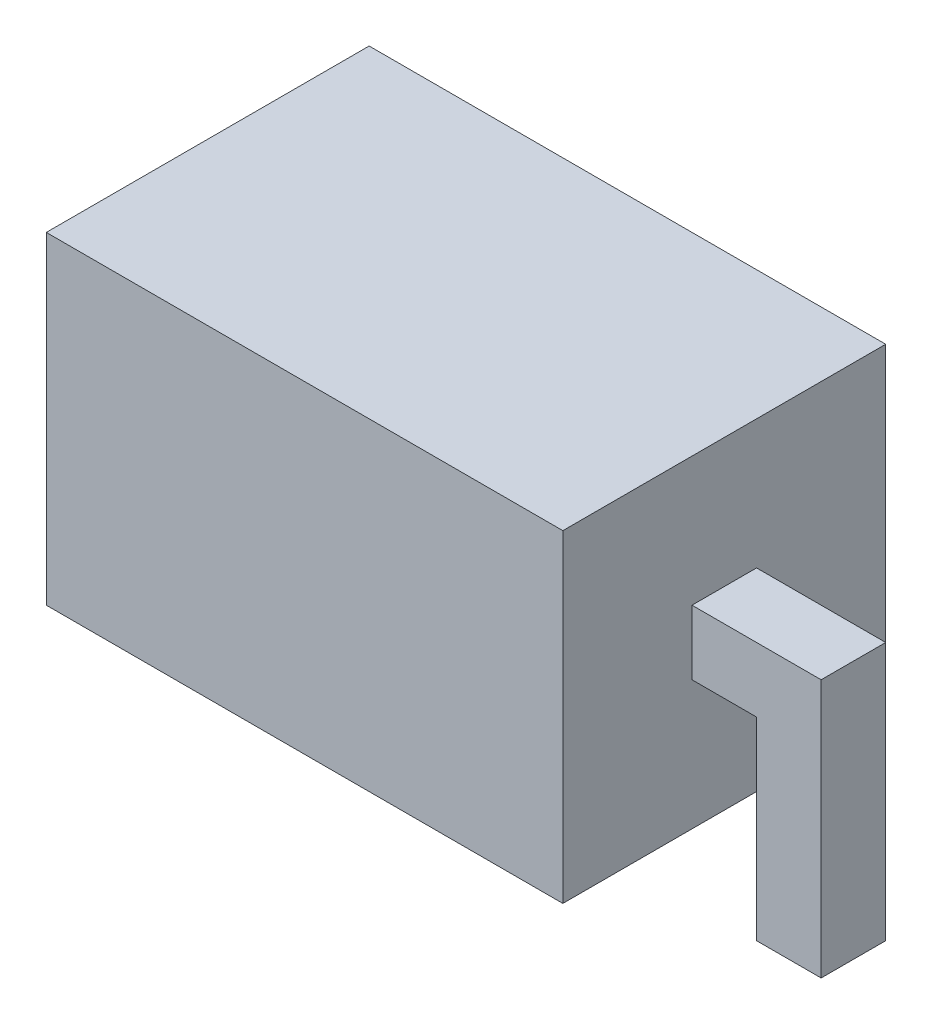
ISO-10303-21;
HEADER;
FILE_DESCRIPTION(('STEP AP214'),'2;1');
FILE_NAME('part.step','',(''),(''),'','','');
FILE_SCHEMA(('AUTOMOTIVE_DESIGN { 1 0 10303 214 1 1 1 1 }'));
ENDSEC;
DATA;
#1=APPLICATION_CONTEXT('core data for automotive mechanical design processes');
#2=APPLICATION_PROTOCOL_DEFINITION('international standard','automotive_design',2000,#1);
#3=PRODUCT_CONTEXT('',#1,'mechanical');
#4=PRODUCT('Part','Part','',(#3));
#5=PRODUCT_RELATED_PRODUCT_CATEGORY('part','',(#4));
#6=PRODUCT_DEFINITION_FORMATION('','',#4);
#7=PRODUCT_DEFINITION_CONTEXT('part definition',#1,'design');
#8=PRODUCT_DEFINITION('design','',#6,#7);
#9=PRODUCT_DEFINITION_SHAPE('','',#8);
#10=(LENGTH_UNIT() NAMED_UNIT(*) SI_UNIT(.MILLI.,.METRE.));
#11=(NAMED_UNIT(*) PLANE_ANGLE_UNIT() SI_UNIT($,.RADIAN.));
#12=(NAMED_UNIT(*) SI_UNIT($,.STERADIAN.) SOLID_ANGLE_UNIT());
#13=UNCERTAINTY_MEASURE_WITH_UNIT(LENGTH_MEASURE(1.E-05),#10,'distance_accuracy_value','');
#14=(GEOMETRIC_REPRESENTATION_CONTEXT(3) GLOBAL_UNCERTAINTY_ASSIGNED_CONTEXT((#13)) GLOBAL_UNIT_ASSIGNED_CONTEXT((#10,
#11,#12)) REPRESENTATION_CONTEXT('',''));
#15=CARTESIAN_POINT('',(0.,0.,0.));
#16=DIRECTION('',(0.,0.,1.));
#17=DIRECTION('',(1.,0.,0.));
#18=AXIS2_PLACEMENT_3D('',#15,#16,#17);
#19=CARTESIAN_POINT('',(2.,-1.25,2.5));
#20=DIRECTION('',(-1.,0.,0.));
#21=DIRECTION('',(0.,0.,1.));
#22=AXIS2_PLACEMENT_3D('',#19,#20,#21);
#23=PLANE('',#22);
#24=DIRECTION('',(0.,1.,0.));
#25=VECTOR('',#24,1.);
#26=CARTESIAN_POINT('',(2.,0.,1.));
#27=LINE('',#26,#25);
#28=CARTESIAN_POINT('',(1.99999999999999,-0.25,1.));
#29=VERTEX_POINT('',#28);
#30=CARTESIAN_POINT('',(2.,0.25,1.));
#31=VERTEX_POINT('',#30);
#32=EDGE_CURVE('E263',#29,#31,#27,.T.);
#33=ORIENTED_EDGE('',*,*,#32,.F.);
#34=DIRECTION('',(0.,0.,1.));
#35=VECTOR('',#34,1.);
#36=CARTESIAN_POINT('',(1.99999999999999,-0.25,1.));
#37=LINE('',#36,#35);
#38=CARTESIAN_POINT('',(1.99999999999999,-0.25,1.5));
#39=VERTEX_POINT('',#38);
#40=EDGE_CURVE('E64',#29,#39,#37,.T.);
#41=ORIENTED_EDGE('',*,*,#40,.T.);
#42=DIRECTION('',(0.,1.,0.));
#43=VECTOR('',#42,1.);
#44=CARTESIAN_POINT('',(2.,0.,1.5));
#45=LINE('',#44,#43);
#46=CARTESIAN_POINT('',(2.,0.25,1.5));
#47=VERTEX_POINT('',#46);
#48=EDGE_CURVE('E241',#39,#47,#45,.T.);
#49=ORIENTED_EDGE('',*,*,#48,.T.);
#50=DIRECTION('',(0.,0.,1.));
#51=VECTOR('',#50,1.);
#52=CARTESIAN_POINT('',(2.,0.25,1.));
#53=LINE('',#52,#51);
#54=EDGE_CURVE('E285',#31,#47,#53,.T.);
#55=ORIENTED_EDGE('',*,*,#54,.F.);
#56=EDGE_LOOP('',(#33,#41,#49,#55));
#57=FACE_BOUND('',#56,.T.);
#58=DIRECTION('',(0.,1.,0.));
#59=VECTOR('',#58,1.);
#60=CARTESIAN_POINT('',(2.,-1.25,0.));
#61=LINE('',#60,#59);
#62=CARTESIAN_POINT('',(2.,-1.25,0.));
#63=VERTEX_POINT('',#62);
#64=CARTESIAN_POINT('',(2.,1.25,0.));
#65=VERTEX_POINT('',#64);
#66=EDGE_CURVE('E279',#63,#65,#61,.T.);
#67=ORIENTED_EDGE('',*,*,#66,.T.);
#68=DIRECTION('',(0.,0.,-1.));
#69=VECTOR('',#68,1.);
#70=CARTESIAN_POINT('',(2.,1.25,2.5));
#71=LINE('',#70,#69);
#72=CARTESIAN_POINT('',(2.,1.25,2.5));
#73=VERTEX_POINT('',#72);
#74=EDGE_CURVE('E11',#73,#65,#71,.T.);
#75=ORIENTED_EDGE('',*,*,#74,.F.);
#76=DIRECTION('',(0.,1.,0.));
#77=VECTOR('',#76,1.);
#78=CARTESIAN_POINT('',(2.,-1.25,2.5));
#79=LINE('',#78,#77);
#80=CARTESIAN_POINT('',(2.,-1.25,2.5));
#81=VERTEX_POINT('',#80);
#82=EDGE_CURVE('E294',#81,#73,#79,.T.);
#83=ORIENTED_EDGE('',*,*,#82,.F.);
#84=DIRECTION('',(0.,0.,-1.));
#85=VECTOR('',#84,1.);
#86=CARTESIAN_POINT('',(2.,-1.25,2.5));
#87=LINE('',#86,#85);
#88=EDGE_CURVE('E308',#81,#63,#87,.T.);
#89=ORIENTED_EDGE('',*,*,#88,.T.);
#90=EDGE_LOOP('',(#67,#75,#83,#89));
#91=FACE_BOUND('',#90,.T.);
#92=ADVANCED_FACE('F41',(#57,#91),#23,.F.);
#93=CARTESIAN_POINT('',(-2.,1.25,2.5));
#94=DIRECTION('',(0.,-1.,0.));
#95=DIRECTION('',(0.,0.,-1.));
#96=AXIS2_PLACEMENT_3D('',#93,#94,#95);
#97=PLANE('',#96);
#98=DIRECTION('',(-1.,0.,0.));
#99=VECTOR('',#98,1.);
#100=CARTESIAN_POINT('',(-2.,1.25,0.));
#101=LINE('',#100,#99);
#102=CARTESIAN_POINT('',(-2.,1.25,0.));
#103=VERTEX_POINT('',#102);
#104=EDGE_CURVE('E312',#65,#103,#101,.T.);
#105=ORIENTED_EDGE('',*,*,#104,.T.);
#106=DIRECTION('',(0.,0.,-1.));
#107=VECTOR('',#106,1.);
#108=CARTESIAN_POINT('',(-2.,1.25,2.5));
#109=LINE('',#108,#107);
#110=CARTESIAN_POINT('',(-2.,1.25,2.5));
#111=VERTEX_POINT('',#110);
#112=EDGE_CURVE('E49',#111,#103,#109,.T.);
#113=ORIENTED_EDGE('',*,*,#112,.F.);
#114=DIRECTION('',(-1.,0.,0.));
#115=VECTOR('',#114,1.);
#116=CARTESIAN_POINT('',(-2.,1.25,2.5));
#117=LINE('',#116,#115);
#118=EDGE_CURVE('E298',#73,#111,#117,.T.);
#119=ORIENTED_EDGE('',*,*,#118,.F.);
#120=ORIENTED_EDGE('',*,*,#74,.T.);
#121=EDGE_LOOP('',(#105,#113,#119,#120));
#122=FACE_BOUND('',#121,.T.);
#123=ADVANCED_FACE('F348',(#122),#97,.F.);
#124=CARTESIAN_POINT('',(-2.,-1.25,2.5));
#125=DIRECTION('',(1.,0.,0.));
#126=DIRECTION('',(0.,0.,-1.));
#127=AXIS2_PLACEMENT_3D('',#124,#125,#126);
#128=PLANE('',#127);
#129=DIRECTION('',(0.,1.,0.));
#130=VECTOR('',#129,1.);
#131=CARTESIAN_POINT('',(-1.99999999999999,0.,1.));
#132=LINE('',#131,#130);
#133=CARTESIAN_POINT('',(-1.99999999999999,-0.25,1.));
#134=VERTEX_POINT('',#133);
#135=CARTESIAN_POINT('',(-2.,0.25,1.));
#136=VERTEX_POINT('',#135);
#137=EDGE_CURVE('E203',#134,#136,#132,.T.);
#138=ORIENTED_EDGE('',*,*,#137,.T.);
#139=DIRECTION('',(0.,0.,1.));
#140=VECTOR('',#139,1.);
#141=CARTESIAN_POINT('',(-2.,0.25,1.));
#142=LINE('',#141,#140);
#143=CARTESIAN_POINT('',(-2.,0.25,1.5));
#144=VERTEX_POINT('',#143);
#145=EDGE_CURVE('E224',#136,#144,#142,.T.);
#146=ORIENTED_EDGE('',*,*,#145,.T.);
#147=DIRECTION('',(0.,1.,0.));
#148=VECTOR('',#147,1.);
#149=CARTESIAN_POINT('',(-1.99999999999999,0.,1.5));
#150=LINE('',#149,#148);
#151=CARTESIAN_POINT('',(-1.99999999999999,-0.25,1.5));
#152=VERTEX_POINT('',#151);
#153=EDGE_CURVE('E177',#152,#144,#150,.T.);
#154=ORIENTED_EDGE('',*,*,#153,.F.);
#155=DIRECTION('',(0.,0.,1.));
#156=VECTOR('',#155,1.);
#157=CARTESIAN_POINT('',(-1.99999999999999,-0.25,1.));
#158=LINE('',#157,#156);
#159=EDGE_CURVE('E167',#134,#152,#158,.T.);
#160=ORIENTED_EDGE('',*,*,#159,.F.);
#161=EDGE_LOOP('',(#138,#146,#154,#160));
#162=FACE_BOUND('',#161,.T.);
#163=DIRECTION('',(0.,-1.,0.));
#164=VECTOR('',#163,1.);
#165=CARTESIAN_POINT('',(-2.,-1.25,0.));
#166=LINE('',#165,#164);
#167=CARTESIAN_POINT('',(-2.,-1.25,0.));
#168=VERTEX_POINT('',#167);
#169=EDGE_CURVE('E315',#103,#168,#166,.T.);
#170=ORIENTED_EDGE('',*,*,#169,.T.);
#171=DIRECTION('',(0.,0.,-1.));
#172=VECTOR('',#171,1.);
#173=CARTESIAN_POINT('',(-2.,-1.25,2.5));
#174=LINE('',#173,#172);
#175=CARTESIAN_POINT('',(-2.,-1.25,2.5));
#176=VERTEX_POINT('',#175);
#177=EDGE_CURVE('E323',#176,#168,#174,.T.);
#178=ORIENTED_EDGE('',*,*,#177,.F.);
#179=DIRECTION('',(0.,-1.,0.));
#180=VECTOR('',#179,1.);
#181=CARTESIAN_POINT('',(-2.,-1.25,2.5));
#182=LINE('',#181,#180);
#183=EDGE_CURVE('E302',#111,#176,#182,.T.);
#184=ORIENTED_EDGE('',*,*,#183,.F.);
#185=ORIENTED_EDGE('',*,*,#112,.T.);
#186=EDGE_LOOP('',(#170,#178,#184,#185));
#187=FACE_BOUND('',#186,.T.);
#188=ADVANCED_FACE('F332',(#162,#187),#128,.F.);
#189=CARTESIAN_POINT('',(-2.,-1.25,2.5));
#190=DIRECTION('',(0.,1.,0.));
#191=DIRECTION('',(0.,0.,1.));
#192=AXIS2_PLACEMENT_3D('',#189,#190,#191);
#193=PLANE('',#192);
#194=DIRECTION('',(1.,0.,0.));
#195=VECTOR('',#194,1.);
#196=CARTESIAN_POINT('',(-2.,-1.25,0.));
#197=LINE('',#196,#195);
#198=EDGE_CURVE('E299',#168,#63,#197,.T.);
#199=ORIENTED_EDGE('',*,*,#198,.T.);
#200=ORIENTED_EDGE('',*,*,#88,.F.);
#201=DIRECTION('',(1.,0.,0.));
#202=VECTOR('',#201,1.);
#203=CARTESIAN_POINT('',(-2.,-1.25,2.5));
#204=LINE('',#203,#202);
#205=EDGE_CURVE('E305',#176,#81,#204,.T.);
#206=ORIENTED_EDGE('',*,*,#205,.F.);
#207=ORIENTED_EDGE('',*,*,#177,.T.);
#208=EDGE_LOOP('',(#199,#200,#206,#207));
#209=FACE_BOUND('',#208,.T.);
#210=ADVANCED_FACE('F341',(#209),#193,.F.);
#211=CARTESIAN_POINT('',(0.,0.,2.5));
#212=DIRECTION('',(0.,0.,-1.));
#213=DIRECTION('',(-1.,0.,0.));
#214=AXIS2_PLACEMENT_3D('',#211,#212,#213);
#215=PLANE('',#214);
#216=ORIENTED_EDGE('',*,*,#82,.T.);
#217=ORIENTED_EDGE('',*,*,#118,.T.);
#218=ORIENTED_EDGE('',*,*,#183,.T.);
#219=ORIENTED_EDGE('',*,*,#205,.T.);
#220=EDGE_LOOP('',(#216,#217,#218,#219));
#221=FACE_BOUND('',#220,.T.);
#222=ADVANCED_FACE('F347',(#221),#215,.F.);
#223=CARTESIAN_POINT('',(0.,0.,0.));
#224=DIRECTION('',(0.,0.,-1.));
#225=DIRECTION('',(-1.,0.,0.));
#226=AXIS2_PLACEMENT_3D('',#223,#224,#225);
#227=PLANE('',#226);
#228=ORIENTED_EDGE('',*,*,#66,.F.);
#229=ORIENTED_EDGE('',*,*,#198,.F.);
#230=ORIENTED_EDGE('',*,*,#169,.F.);
#231=ORIENTED_EDGE('',*,*,#104,.F.);
#232=EDGE_LOOP('',(#228,#229,#230,#231));
#233=FACE_BOUND('',#232,.T.);
#234=ADVANCED_FACE('F338',(#233),#227,.T.);
#235=CARTESIAN_POINT('',(0.,-1.75,1.));
#236=DIRECTION('',(0.,-1.,0.));
#237=DIRECTION('',(0.,0.,-1.));
#238=AXIS2_PLACEMENT_3D('',#235,#236,#237);
#239=PLANE('',#238);
#240=DIRECTION('',(0.,0.,1.));
#241=VECTOR('',#240,1.);
#242=CARTESIAN_POINT('',(3.,-1.75,1.));
#243=LINE('',#242,#241);
#244=CARTESIAN_POINT('',(3.,-1.75,1.));
#245=VERTEX_POINT('',#244);
#246=CARTESIAN_POINT('',(3.,-1.75,1.5));
#247=VERTEX_POINT('',#246);
#248=EDGE_CURVE('E275',#245,#247,#243,.T.);
#249=ORIENTED_EDGE('',*,*,#248,.T.);
#250=DIRECTION('',(1.,0.,0.));
#251=VECTOR('',#250,1.);
#252=CARTESIAN_POINT('',(0.,-1.75,1.5));
#253=LINE('',#252,#251);
#254=CARTESIAN_POINT('',(2.5,-1.75,1.5));
#255=VERTEX_POINT('',#254);
#256=EDGE_CURVE('E217',#255,#247,#253,.T.);
#257=ORIENTED_EDGE('',*,*,#256,.F.);
#258=DIRECTION('',(0.,0.,1.));
#259=VECTOR('',#258,1.);
#260=CARTESIAN_POINT('',(2.5,-1.75,1.));
#261=LINE('',#260,#259);
#262=CARTESIAN_POINT('',(2.5,-1.75,1.));
#263=VERTEX_POINT('',#262);
#264=EDGE_CURVE('E276',#263,#255,#261,.T.);
#265=ORIENTED_EDGE('',*,*,#264,.F.);
#266=DIRECTION('',(1.,0.,0.));
#267=VECTOR('',#266,1.);
#268=CARTESIAN_POINT('',(0.,-1.75,1.));
#269=LINE('',#268,#267);
#270=EDGE_CURVE('E252',#263,#245,#269,.T.);
#271=ORIENTED_EDGE('',*,*,#270,.T.);
#272=EDGE_LOOP('',(#249,#257,#265,#271));
#273=FACE_BOUND('',#272,.T.);
#274=ADVANCED_FACE('F361',(#273),#239,.T.);
#275=CARTESIAN_POINT('',(2.5,0.,1.));
#276=DIRECTION('',(-1.,0.,0.));
#277=DIRECTION('',(0.,-1.,0.));
#278=AXIS2_PLACEMENT_3D('',#275,#276,#277);
#279=PLANE('',#278);
#280=ORIENTED_EDGE('',*,*,#264,.T.);
#281=DIRECTION('',(0.,-1.,0.));
#282=VECTOR('',#281,1.);
#283=CARTESIAN_POINT('',(2.5,0.,1.5));
#284=LINE('',#283,#282);
#285=CARTESIAN_POINT('',(2.5,-0.25,1.5));
#286=VERTEX_POINT('',#285);
#287=EDGE_CURVE('E248',#286,#255,#284,.T.);
#288=ORIENTED_EDGE('',*,*,#287,.F.);
#289=DIRECTION('',(0.,0.,1.));
#290=VECTOR('',#289,1.);
#291=CARTESIAN_POINT('',(2.5,-0.25,1.));
#292=LINE('',#291,#290);
#293=CARTESIAN_POINT('',(2.5,-0.25,1.));
#294=VERTEX_POINT('',#293);
#295=EDGE_CURVE('E280',#294,#286,#292,.T.);
#296=ORIENTED_EDGE('',*,*,#295,.F.);
#297=DIRECTION('',(0.,-1.,0.));
#298=VECTOR('',#297,1.);
#299=CARTESIAN_POINT('',(2.5,0.,1.));
#300=LINE('',#299,#298);
#301=EDGE_CURVE('E271',#294,#263,#300,.T.);
#302=ORIENTED_EDGE('',*,*,#301,.T.);
#303=EDGE_LOOP('',(#280,#288,#296,#302));
#304=FACE_BOUND('',#303,.T.);
#305=ADVANCED_FACE('F366',(#304),#279,.T.);
#306=CARTESIAN_POINT('',(0.,-0.249999999999998,1.));
#307=DIRECTION('',(0.,1.,0.));
#308=DIRECTION('',(-1.,0.,0.));
#309=AXIS2_PLACEMENT_3D('',#306,#307,#308);
#310=PLANE('',#309);
#311=ORIENTED_EDGE('',*,*,#295,.T.);
#312=DIRECTION('',(-1.,0.,0.));
#313=VECTOR('',#312,1.);
#314=CARTESIAN_POINT('',(0.,-0.249999999999998,1.5));
#315=LINE('',#314,#313);
#316=EDGE_CURVE('E244',#286,#39,#315,.T.);
#317=ORIENTED_EDGE('',*,*,#316,.T.);
#318=ORIENTED_EDGE('',*,*,#40,.F.);
#319=DIRECTION('',(-1.,0.,0.));
#320=VECTOR('',#319,1.);
#321=CARTESIAN_POINT('',(0.,-0.249999999999998,1.));
#322=LINE('',#321,#320);
#323=EDGE_CURVE('E267',#294,#29,#322,.T.);
#324=ORIENTED_EDGE('',*,*,#323,.F.);
#325=EDGE_LOOP('',(#311,#317,#318,#324));
#326=FACE_BOUND('',#325,.T.);
#327=ADVANCED_FACE('F376',(#326),#310,.F.);
#328=CARTESIAN_POINT('',(0.,0.250000000000001,1.));
#329=DIRECTION('',(0.,-1.,0.));
#330=DIRECTION('',(1.,0.,0.));
#331=AXIS2_PLACEMENT_3D('',#328,#329,#330);
#332=PLANE('',#331);
#333=ORIENTED_EDGE('',*,*,#54,.T.);
#334=DIRECTION('',(1.,0.,0.));
#335=VECTOR('',#334,1.);
#336=CARTESIAN_POINT('',(0.,0.250000000000001,1.5));
#337=LINE('',#336,#335);
#338=CARTESIAN_POINT('',(3.,0.25,1.5));
#339=VERTEX_POINT('',#338);
#340=EDGE_CURVE('E237',#47,#339,#337,.T.);
#341=ORIENTED_EDGE('',*,*,#340,.T.);
#342=DIRECTION('',(0.,0.,1.));
#343=VECTOR('',#342,1.);
#344=CARTESIAN_POINT('',(3.,0.25,1.));
#345=LINE('',#344,#343);
#346=CARTESIAN_POINT('',(3.,0.25,1.));
#347=VERTEX_POINT('',#346);
#348=EDGE_CURVE('E289',#347,#339,#345,.T.);
#349=ORIENTED_EDGE('',*,*,#348,.F.);
#350=DIRECTION('',(1.,0.,0.));
#351=VECTOR('',#350,1.);
#352=CARTESIAN_POINT('',(0.,0.250000000000001,1.));
#353=LINE('',#352,#351);
#354=EDGE_CURVE('E260',#31,#347,#353,.T.);
#355=ORIENTED_EDGE('',*,*,#354,.F.);
#356=EDGE_LOOP('',(#333,#341,#349,#355));
#357=FACE_BOUND('',#356,.T.);
#358=ADVANCED_FACE('F372',(#357),#332,.F.);
#359=CARTESIAN_POINT('',(3.,0.,1.));
#360=DIRECTION('',(1.,0.,0.));
#361=DIRECTION('',(0.,0.,-1.));
#362=AXIS2_PLACEMENT_3D('',#359,#360,#361);
#363=PLANE('',#362);
#364=ORIENTED_EDGE('',*,*,#348,.T.);
#365=DIRECTION('',(0.,1.,0.));
#366=VECTOR('',#365,1.);
#367=CARTESIAN_POINT('',(3.,0.,1.5));
#368=LINE('',#367,#366);
#369=EDGE_CURVE('E233',#247,#339,#368,.T.);
#370=ORIENTED_EDGE('',*,*,#369,.F.);
#371=ORIENTED_EDGE('',*,*,#248,.F.);
#372=DIRECTION('',(0.,1.,0.));
#373=VECTOR('',#372,1.);
#374=CARTESIAN_POINT('',(3.,0.,1.));
#375=LINE('',#374,#373);
#376=EDGE_CURVE('E256',#245,#347,#375,.T.);
#377=ORIENTED_EDGE('',*,*,#376,.T.);
#378=EDGE_LOOP('',(#364,#370,#371,#377));
#379=FACE_BOUND('',#378,.T.);
#380=ADVANCED_FACE('F368',(#379),#363,.T.);
#381=CARTESIAN_POINT('',(0.,0.,1.));
#382=DIRECTION('',(0.,0.,1.));
#383=DIRECTION('',(1.,0.,0.));
#384=AXIS2_PLACEMENT_3D('',#381,#382,#383);
#385=PLANE('',#384);
#386=ORIENTED_EDGE('',*,*,#270,.F.);
#387=ORIENTED_EDGE('',*,*,#301,.F.);
#388=ORIENTED_EDGE('',*,*,#323,.T.);
#389=ORIENTED_EDGE('',*,*,#32,.T.);
#390=ORIENTED_EDGE('',*,*,#354,.T.);
#391=ORIENTED_EDGE('',*,*,#376,.F.);
#392=EDGE_LOOP('',(#386,#387,#388,#389,#390,#391));
#393=FACE_BOUND('',#392,.T.);
#394=ADVANCED_FACE('F371',(#393),#385,.F.);
#395=CARTESIAN_POINT('',(0.,0.,1.5));
#396=DIRECTION('',(0.,0.,1.));
#397=DIRECTION('',(1.,0.,0.));
#398=AXIS2_PLACEMENT_3D('',#395,#396,#397);
#399=PLANE('',#398);
#400=ORIENTED_EDGE('',*,*,#256,.T.);
#401=ORIENTED_EDGE('',*,*,#369,.T.);
#402=ORIENTED_EDGE('',*,*,#340,.F.);
#403=ORIENTED_EDGE('',*,*,#48,.F.);
#404=ORIENTED_EDGE('',*,*,#316,.F.);
#405=ORIENTED_EDGE('',*,*,#287,.T.);
#406=EDGE_LOOP('',(#400,#401,#402,#403,#404,#405));
#407=FACE_BOUND('',#406,.T.);
#408=ADVANCED_FACE('F386',(#407),#399,.T.);
#409=CARTESIAN_POINT('',(-2.5,0.,1.));
#410=DIRECTION('',(-1.,0.,0.));
#411=DIRECTION('',(0.,0.,1.));
#412=AXIS2_PLACEMENT_3D('',#409,#410,#411);
#413=PLANE('',#412);
#414=DIRECTION('',(0.,0.,1.));
#415=VECTOR('',#414,1.);
#416=CARTESIAN_POINT('',(-2.5,-0.25,1.));
#417=LINE('',#416,#415);
#418=CARTESIAN_POINT('',(-2.5,-0.25,1.));
#419=VERTEX_POINT('',#418);
#420=CARTESIAN_POINT('',(-2.5,-0.25,1.5));
#421=VERTEX_POINT('',#420);
#422=EDGE_CURVE('E154',#419,#421,#417,.T.);
#423=ORIENTED_EDGE('',*,*,#422,.T.);
#424=DIRECTION('',(0.,-1.,0.));
#425=VECTOR('',#424,1.);
#426=CARTESIAN_POINT('',(-2.5,0.,1.5));
#427=LINE('',#426,#425);
#428=CARTESIAN_POINT('',(-2.5,-1.75,1.5));
#429=VERTEX_POINT('',#428);
#430=EDGE_CURVE('E159',#421,#429,#427,.T.);
#431=ORIENTED_EDGE('',*,*,#430,.T.);
#432=DIRECTION('',(0.,0.,1.));
#433=VECTOR('',#432,1.);
#434=CARTESIAN_POINT('',(-2.5,-1.75,1.));
#435=LINE('',#434,#433);
#436=CARTESIAN_POINT('',(-2.5,-1.75,1.));
#437=VERTEX_POINT('',#436);
#438=EDGE_CURVE('E214',#437,#429,#435,.T.);
#439=ORIENTED_EDGE('',*,*,#438,.F.);
#440=DIRECTION('',(0.,-1.,0.));
#441=VECTOR('',#440,1.);
#442=CARTESIAN_POINT('',(-2.5,0.,1.));
#443=LINE('',#442,#441);
#444=EDGE_CURVE('E162',#419,#437,#443,.T.);
#445=ORIENTED_EDGE('',*,*,#444,.F.);
#446=EDGE_LOOP('',(#423,#431,#439,#445));
#447=FACE_BOUND('',#446,.T.);
#448=ADVANCED_FACE('F156',(#447),#413,.F.);
#449=CARTESIAN_POINT('',(0.,-1.75,1.));
#450=DIRECTION('',(0.,1.,0.));
#451=DIRECTION('',(0.,0.,1.));
#452=AXIS2_PLACEMENT_3D('',#449,#450,#451);
#453=PLANE('',#452);
#454=ORIENTED_EDGE('',*,*,#438,.T.);
#455=DIRECTION('',(-1.,0.,0.));
#456=VECTOR('',#455,1.);
#457=CARTESIAN_POINT('',(0.,-1.75,1.5));
#458=LINE('',#457,#456);
#459=CARTESIAN_POINT('',(-3.,-1.75,1.5));
#460=VERTEX_POINT('',#459);
#461=EDGE_CURVE('E182',#429,#460,#458,.T.);
#462=ORIENTED_EDGE('',*,*,#461,.T.);
#463=DIRECTION('',(0.,0.,1.));
#464=VECTOR('',#463,1.);
#465=CARTESIAN_POINT('',(-3.,-1.75,1.));
#466=LINE('',#465,#464);
#467=CARTESIAN_POINT('',(-3.,-1.75,1.));
#468=VERTEX_POINT('',#467);
#469=EDGE_CURVE('E218',#468,#460,#466,.T.);
#470=ORIENTED_EDGE('',*,*,#469,.F.);
#471=DIRECTION('',(-1.,0.,0.));
#472=VECTOR('',#471,1.);
#473=CARTESIAN_POINT('',(0.,-1.75,1.));
#474=LINE('',#473,#472);
#475=EDGE_CURVE('E168',#437,#468,#474,.T.);
#476=ORIENTED_EDGE('',*,*,#475,.F.);
#477=EDGE_LOOP('',(#454,#462,#470,#476));
#478=FACE_BOUND('',#477,.T.);
#479=ADVANCED_FACE('F393',(#478),#453,.F.);
#480=CARTESIAN_POINT('',(-3.,0.,1.));
#481=DIRECTION('',(1.,0.,0.));
#482=DIRECTION('',(0.,1.,0.));
#483=AXIS2_PLACEMENT_3D('',#480,#481,#482);
#484=PLANE('',#483);
#485=ORIENTED_EDGE('',*,*,#469,.T.);
#486=DIRECTION('',(0.,1.,0.));
#487=VECTOR('',#486,1.);
#488=CARTESIAN_POINT('',(-3.,0.,1.5));
#489=LINE('',#488,#487);
#490=CARTESIAN_POINT('',(-3.,0.249999999999999,1.5));
#491=VERTEX_POINT('',#490);
#492=EDGE_CURVE('E192',#460,#491,#489,.T.);
#493=ORIENTED_EDGE('',*,*,#492,.T.);
#494=DIRECTION('',(0.,0.,1.));
#495=VECTOR('',#494,1.);
#496=CARTESIAN_POINT('',(-3.,0.249999999999999,1.));
#497=LINE('',#496,#495);
#498=CARTESIAN_POINT('',(-3.,0.249999999999999,1.));
#499=VERTEX_POINT('',#498);
#500=EDGE_CURVE('E221',#499,#491,#497,.T.);
#501=ORIENTED_EDGE('',*,*,#500,.F.);
#502=DIRECTION('',(0.,1.,0.));
#503=VECTOR('',#502,1.);
#504=CARTESIAN_POINT('',(-3.,0.,1.));
#505=LINE('',#504,#503);
#506=EDGE_CURVE('E209',#468,#499,#505,.T.);
#507=ORIENTED_EDGE('',*,*,#506,.F.);
#508=EDGE_LOOP('',(#485,#493,#501,#507));
#509=FACE_BOUND('',#508,.T.);
#510=ADVANCED_FACE('F400',(#509),#484,.F.);
#511=CARTESIAN_POINT('',(0.,0.250000000000002,1.));
#512=DIRECTION('',(0.,1.,0.));
#513=DIRECTION('',(-1.,0.,0.));
#514=AXIS2_PLACEMENT_3D('',#511,#512,#513);
#515=PLANE('',#514);
#516=ORIENTED_EDGE('',*,*,#500,.T.);
#517=DIRECTION('',(-1.,0.,0.));
#518=VECTOR('',#517,1.);
#519=CARTESIAN_POINT('',(0.,0.250000000000002,1.5));
#520=LINE('',#519,#518);
#521=EDGE_CURVE('E188',#144,#491,#520,.T.);
#522=ORIENTED_EDGE('',*,*,#521,.F.);
#523=ORIENTED_EDGE('',*,*,#145,.F.);
#524=DIRECTION('',(-1.,0.,0.));
#525=VECTOR('',#524,1.);
#526=CARTESIAN_POINT('',(0.,0.250000000000002,1.));
#527=LINE('',#526,#525);
#528=EDGE_CURVE('E56',#136,#499,#527,.T.);
#529=ORIENTED_EDGE('',*,*,#528,.T.);
#530=EDGE_LOOP('',(#516,#522,#523,#529));
#531=FACE_BOUND('',#530,.T.);
#532=ADVANCED_FACE('F397',(#531),#515,.T.);
#533=CARTESIAN_POINT('',(0.,-0.249999999999997,1.));
#534=DIRECTION('',(0.,-1.,0.));
#535=DIRECTION('',(1.,0.,0.));
#536=AXIS2_PLACEMENT_3D('',#533,#534,#535);
#537=PLANE('',#536);
#538=ORIENTED_EDGE('',*,*,#159,.T.);
#539=DIRECTION('',(1.,0.,0.));
#540=VECTOR('',#539,1.);
#541=CARTESIAN_POINT('',(0.,-0.249999999999997,1.5));
#542=LINE('',#541,#540);
#543=EDGE_CURVE('E171',#421,#152,#542,.T.);
#544=ORIENTED_EDGE('',*,*,#543,.F.);
#545=ORIENTED_EDGE('',*,*,#422,.F.);
#546=DIRECTION('',(1.,0.,0.));
#547=VECTOR('',#546,1.);
#548=CARTESIAN_POINT('',(0.,-0.249999999999997,1.));
#549=LINE('',#548,#547);
#550=EDGE_CURVE('E200',#419,#134,#549,.T.);
#551=ORIENTED_EDGE('',*,*,#550,.T.);
#552=EDGE_LOOP('',(#538,#544,#545,#551));
#553=FACE_BOUND('',#552,.T.);
#554=ADVANCED_FACE('F172',(#553),#537,.T.);
#555=CARTESIAN_POINT('',(0.,0.,1.));
#556=DIRECTION('',(0.,0.,1.));
#557=DIRECTION('',(1.,0.,0.));
#558=AXIS2_PLACEMENT_3D('',#555,#556,#557);
#559=PLANE('',#558);
#560=ORIENTED_EDGE('',*,*,#444,.T.);
#561=ORIENTED_EDGE('',*,*,#475,.T.);
#562=ORIENTED_EDGE('',*,*,#506,.T.);
#563=ORIENTED_EDGE('',*,*,#528,.F.);
#564=ORIENTED_EDGE('',*,*,#137,.F.);
#565=ORIENTED_EDGE('',*,*,#550,.F.);
#566=EDGE_LOOP('',(#560,#561,#562,#563,#564,#565));
#567=FACE_BOUND('',#566,.T.);
#568=ADVANCED_FACE('F396',(#567),#559,.F.);
#569=CARTESIAN_POINT('',(0.,0.,1.5));
#570=DIRECTION('',(0.,0.,1.));
#571=DIRECTION('',(1.,0.,0.));
#572=AXIS2_PLACEMENT_3D('',#569,#570,#571);
#573=PLANE('',#572);
#574=ORIENTED_EDGE('',*,*,#430,.F.);
#575=ORIENTED_EDGE('',*,*,#543,.T.);
#576=ORIENTED_EDGE('',*,*,#153,.T.);
#577=ORIENTED_EDGE('',*,*,#521,.T.);
#578=ORIENTED_EDGE('',*,*,#492,.F.);
#579=ORIENTED_EDGE('',*,*,#461,.F.);
#580=EDGE_LOOP('',(#574,#575,#576,#577,#578,#579));
#581=FACE_BOUND('',#580,.T.);
#582=ADVANCED_FACE('F179',(#581),#573,.T.);
#583=CLOSED_SHELL('',(#92,#123,#188,#210,#222,#234,#274,#305,#327,#358,#380,#394,#408,#448,#479,
#510,#532,#554,#568,#582));
#584=MANIFOLD_SOLID_BREP('B2',#583);
#585=ADVANCED_BREP_SHAPE_REPRESENTATION('',(#18,#584),#14);
#586=SHAPE_DEFINITION_REPRESENTATION(#9,#585);
ENDSEC;
END-ISO-10303-21;
